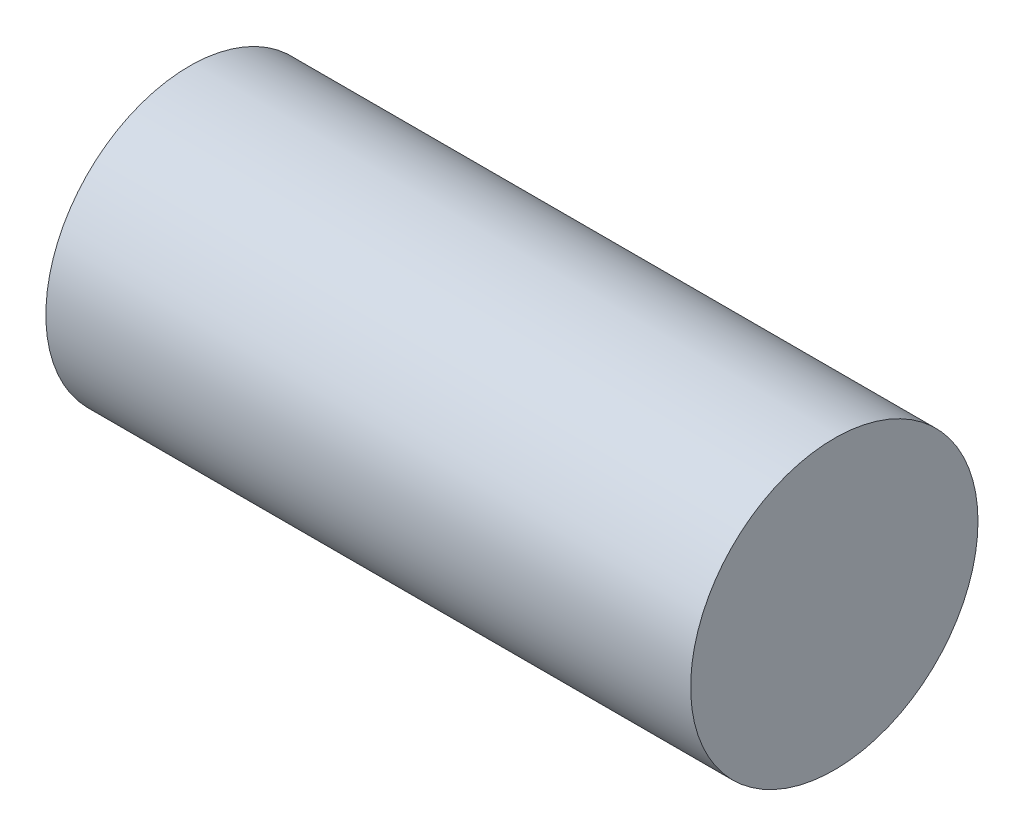
ISO-10303-21;
HEADER;
FILE_DESCRIPTION(('STEP AP214'),'2;1');
FILE_NAME('part.step','',(''),(''),'','','');
FILE_SCHEMA(('AUTOMOTIVE_DESIGN { 1 0 10303 214 1 1 1 1 }'));
ENDSEC;
DATA;
#1=APPLICATION_CONTEXT('core data for automotive mechanical design processes');
#2=APPLICATION_PROTOCOL_DEFINITION('international standard','automotive_design',2000,#1);
#3=PRODUCT_CONTEXT('',#1,'mechanical');
#4=PRODUCT('Part','Part','',(#3));
#5=PRODUCT_RELATED_PRODUCT_CATEGORY('part','',(#4));
#6=PRODUCT_DEFINITION_FORMATION('','',#4);
#7=PRODUCT_DEFINITION_CONTEXT('part definition',#1,'design');
#8=PRODUCT_DEFINITION('design','',#6,#7);
#9=PRODUCT_DEFINITION_SHAPE('','',#8);
#10=(LENGTH_UNIT() NAMED_UNIT(*) SI_UNIT(.MILLI.,.METRE.));
#11=(NAMED_UNIT(*) PLANE_ANGLE_UNIT() SI_UNIT($,.RADIAN.));
#12=(NAMED_UNIT(*) SI_UNIT($,.STERADIAN.) SOLID_ANGLE_UNIT());
#13=UNCERTAINTY_MEASURE_WITH_UNIT(LENGTH_MEASURE(1.E-05),#10,'distance_accuracy_value','');
#14=(GEOMETRIC_REPRESENTATION_CONTEXT(3) GLOBAL_UNCERTAINTY_ASSIGNED_CONTEXT((#13)) GLOBAL_UNIT_ASSIGNED_CONTEXT((#10,
#11,#12)) REPRESENTATION_CONTEXT('',''));
#15=CARTESIAN_POINT('',(0.,0.,0.));
#16=DIRECTION('',(0.,0.,1.));
#17=DIRECTION('',(1.,0.,0.));
#18=AXIS2_PLACEMENT_3D('',#15,#16,#17);
#19=CARTESIAN_POINT('',(28.4988,0.,0.));
#20=DIRECTION('',(-1.,0.,0.));
#21=DIRECTION('',(0.,0.,1.));
#22=AXIS2_PLACEMENT_3D('',#19,#20,#21);
#23=CYLINDRICAL_SURFACE('',#22,6.35);
#24=CARTESIAN_POINT('',(28.4988,0.,0.));
#25=DIRECTION('',(1.,0.,0.));
#26=DIRECTION('',(0.,0.,-1.));
#27=AXIS2_PLACEMENT_3D('',#24,#25,#26);
#28=CIRCLE('',#27,6.35);
#29=CARTESIAN_POINT('',(28.4988,0.,-6.35));
#30=VERTEX_POINT('',#29);
#31=EDGE_CURVE('E10',#30,#30,#28,.T.);
#32=ORIENTED_EDGE('',*,*,#31,.F.);
#33=EDGE_LOOP('',(#32));
#34=FACE_BOUND('',#33,.T.);
#35=CARTESIAN_POINT('',(0.,0.,0.));
#36=DIRECTION('',(1.,0.,0.));
#37=DIRECTION('',(0.,0.,-1.));
#38=AXIS2_PLACEMENT_3D('',#35,#36,#37);
#39=CIRCLE('',#38,6.35);
#40=CARTESIAN_POINT('',(0.,0.,-6.35));
#41=VERTEX_POINT('',#40);
#42=EDGE_CURVE('E37',#41,#41,#39,.T.);
#43=ORIENTED_EDGE('',*,*,#42,.T.);
#44=EDGE_LOOP('',(#43));
#45=FACE_BOUND('',#44,.T.);
#46=ADVANCED_FACE('F34',(#34,#45),#23,.T.);
#47=CARTESIAN_POINT('',(28.4988,0.,0.));
#48=DIRECTION('',(1.,0.,0.));
#49=DIRECTION('',(0.,0.,-1.));
#50=AXIS2_PLACEMENT_3D('',#47,#48,#49);
#51=PLANE('',#50);
#52=ORIENTED_EDGE('',*,*,#31,.T.);
#53=EDGE_LOOP('',(#52));
#54=FACE_BOUND('',#53,.T.);
#55=ADVANCED_FACE('F49',(#54),#51,.T.);
#56=CARTESIAN_POINT('',(0.,0.,0.));
#57=DIRECTION('',(1.,0.,0.));
#58=DIRECTION('',(0.,0.,-1.));
#59=AXIS2_PLACEMENT_3D('',#56,#57,#58);
#60=PLANE('',#59);
#61=ORIENTED_EDGE('',*,*,#42,.F.);
#62=EDGE_LOOP('',(#61));
#63=FACE_BOUND('',#62,.T.);
#64=ADVANCED_FACE('F47',(#63),#60,.F.);
#65=CLOSED_SHELL('',(#46,#55,#64));
#66=MANIFOLD_SOLID_BREP('B2',#65);
#67=ADVANCED_BREP_SHAPE_REPRESENTATION('',(#18,#66),#14);
#68=SHAPE_DEFINITION_REPRESENTATION(#9,#67);
ENDSEC;
END-ISO-10303-21;
